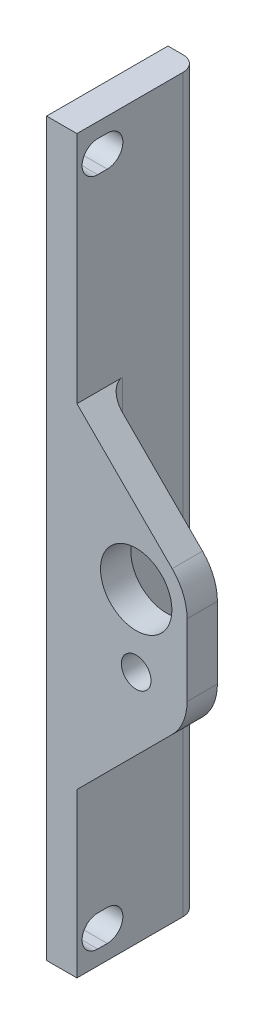
ISO-10303-21;
HEADER;
FILE_DESCRIPTION(('STEP AP214'),'2;1');
FILE_NAME('part.step','',(''),(''),'','','');
FILE_SCHEMA(('AUTOMOTIVE_DESIGN { 1 0 10303 214 1 1 1 1 }'));
ENDSEC;
DATA;
#1=APPLICATION_CONTEXT('core data for automotive mechanical design processes');
#2=APPLICATION_PROTOCOL_DEFINITION('international standard','automotive_design',2000,#1);
#3=PRODUCT_CONTEXT('',#1,'mechanical');
#4=PRODUCT('Part','Part','',(#3));
#5=PRODUCT_RELATED_PRODUCT_CATEGORY('part','',(#4));
#6=PRODUCT_DEFINITION_FORMATION('','',#4);
#7=PRODUCT_DEFINITION_CONTEXT('part definition',#1,'design');
#8=PRODUCT_DEFINITION('design','',#6,#7);
#9=PRODUCT_DEFINITION_SHAPE('','',#8);
#10=(LENGTH_UNIT() NAMED_UNIT(*) SI_UNIT(.MILLI.,.METRE.));
#11=(NAMED_UNIT(*) PLANE_ANGLE_UNIT() SI_UNIT($,.RADIAN.));
#12=(NAMED_UNIT(*) SI_UNIT($,.STERADIAN.) SOLID_ANGLE_UNIT());
#13=UNCERTAINTY_MEASURE_WITH_UNIT(LENGTH_MEASURE(1.E-05),#10,'distance_accuracy_value','');
#14=(GEOMETRIC_REPRESENTATION_CONTEXT(3) GLOBAL_UNCERTAINTY_ASSIGNED_CONTEXT((#13)) GLOBAL_UNIT_ASSIGNED_CONTEXT((#10,
#11,#12)) REPRESENTATION_CONTEXT('',''));
#15=CARTESIAN_POINT('',(0.,0.,0.));
#16=DIRECTION('',(0.,0.,1.));
#17=DIRECTION('',(1.,0.,0.));
#18=AXIS2_PLACEMENT_3D('',#15,#16,#17);
#19=CARTESIAN_POINT('',(6.35,0.,0.));
#20=DIRECTION('',(-1.,0.,0.));
#21=DIRECTION('',(0.,0.,1.));
#22=AXIS2_PLACEMENT_3D('',#19,#20,#21);
#23=PLANE('',#22);
#24=CARTESIAN_POINT('',(6.35,70.174739,0.));
#25=DIRECTION('',(1.,0.,0.));
#26=DIRECTION('',(0.,0.,-1.));
#27=AXIS2_PLACEMENT_3D('',#24,#25,#26);
#28=CIRCLE('',#27,3.2639);
#29=CARTESIAN_POINT('',(6.35,73.438639,0.));
#30=VERTEX_POINT('',#29);
#31=CARTESIAN_POINT('',(6.35,66.910839,0.));
#32=VERTEX_POINT('',#31);
#33=EDGE_CURVE('E244',#30,#32,#28,.T.);
#34=ORIENTED_EDGE('',*,*,#33,.F.);
#35=DIRECTION('',(0.,0.,1.));
#36=VECTOR('',#35,1.);
#37=CARTESIAN_POINT('',(6.35,73.438639,0.));
#38=LINE('',#37,#36);
#39=CARTESIAN_POINT('',(6.35,73.438639,-2.));
#40=VERTEX_POINT('',#39);
#41=EDGE_CURVE('E255',#40,#30,#38,.T.);
#42=ORIENTED_EDGE('',*,*,#41,.F.);
#43=CARTESIAN_POINT('',(6.35,70.174739,-2.));
#44=DIRECTION('',(1.,0.,0.));
#45=DIRECTION('',(0.,0.,-1.));
#46=AXIS2_PLACEMENT_3D('',#43,#44,#45);
#47=CIRCLE('',#46,3.2639);
#48=CARTESIAN_POINT('',(6.35,66.910839,-2.));
#49=VERTEX_POINT('',#48);
#50=EDGE_CURVE('E251',#49,#40,#47,.T.);
#51=ORIENTED_EDGE('',*,*,#50,.F.);
#52=DIRECTION('',(0.,0.,-1.));
#53=VECTOR('',#52,1.);
#54=CARTESIAN_POINT('',(6.35,66.910839,0.));
#55=LINE('',#54,#53);
#56=EDGE_CURVE('E247',#32,#49,#55,.T.);
#57=ORIENTED_EDGE('',*,*,#56,.F.);
#58=EDGE_LOOP('',(#34,#42,#51,#57));
#59=FACE_BOUND('',#58,.T.);
#60=CARTESIAN_POINT('',(6.35,-70.174739,-2.));
#61=DIRECTION('',(1.,0.,0.));
#62=DIRECTION('',(0.,0.,1.));
#63=AXIS2_PLACEMENT_3D('',#60,#61,#62);
#64=CIRCLE('',#63,3.2639);
#65=CARTESIAN_POINT('',(6.35,-73.438639,-2.));
#66=VERTEX_POINT('',#65);
#67=CARTESIAN_POINT('',(6.35,-66.910839,-2.));
#68=VERTEX_POINT('',#67);
#69=EDGE_CURVE('E287',#66,#68,#64,.T.);
#70=ORIENTED_EDGE('',*,*,#69,.F.);
#71=DIRECTION('',(0.,0.,-1.));
#72=VECTOR('',#71,1.);
#73=CARTESIAN_POINT('',(6.35,-73.438639,0.));
#74=LINE('',#73,#72);
#75=CARTESIAN_POINT('',(6.35,-73.438639,0.));
#76=VERTEX_POINT('',#75);
#77=EDGE_CURVE('E298',#76,#66,#74,.T.);
#78=ORIENTED_EDGE('',*,*,#77,.F.);
#79=CARTESIAN_POINT('',(6.35,-70.174739,0.));
#80=DIRECTION('',(1.,0.,0.));
#81=DIRECTION('',(0.,0.,1.));
#82=AXIS2_PLACEMENT_3D('',#79,#80,#81);
#83=CIRCLE('',#82,3.2639);
#84=CARTESIAN_POINT('',(6.35,-66.910839,0.));
#85=VERTEX_POINT('',#84);
#86=EDGE_CURVE('E294',#85,#76,#83,.T.);
#87=ORIENTED_EDGE('',*,*,#86,.F.);
#88=DIRECTION('',(0.,0.,1.));
#89=VECTOR('',#88,1.);
#90=CARTESIAN_POINT('',(6.35,-66.910839,0.));
#91=LINE('',#90,#89);
#92=EDGE_CURVE('E290',#68,#85,#91,.T.);
#93=ORIENTED_EDGE('',*,*,#92,.F.);
#94=EDGE_LOOP('',(#70,#78,#87,#93));
#95=FACE_BOUND('',#94,.T.);
#96=DIRECTION('',(0.,0.,-1.));
#97=VECTOR('',#96,1.);
#98=CARTESIAN_POINT('',(6.35,-76.524739,4.34721));
#99=LINE('',#98,#97);
#100=CARTESIAN_POINT('',(6.35,-76.524739,4.34721));
#101=VERTEX_POINT('',#100);
#102=CARTESIAN_POINT('',(6.35,-76.524739,-17.87779));
#103=VERTEX_POINT('',#102);
#104=EDGE_CURVE('E339',#101,#103,#99,.T.);
#105=ORIENTED_EDGE('',*,*,#104,.T.);
#106=DIRECTION('',(0.,1.,0.));
#107=VECTOR('',#106,1.);
#108=CARTESIAN_POINT('',(6.35,0.,-17.87779));
#109=LINE('',#108,#107);
#110=CARTESIAN_POINT('',(6.35,76.524739,-17.87779));
#111=VERTEX_POINT('',#110);
#112=EDGE_CURVE('E374',#103,#111,#109,.T.);
#113=ORIENTED_EDGE('',*,*,#112,.T.);
#114=DIRECTION('',(0.,0.,1.));
#115=VECTOR('',#114,1.);
#116=CARTESIAN_POINT('',(6.35,76.524739,-4.34721));
#117=LINE('',#116,#115);
#118=CARTESIAN_POINT('',(6.35,76.524739,4.34721));
#119=VERTEX_POINT('',#118);
#120=EDGE_CURVE('E330',#111,#119,#117,.T.);
#121=ORIENTED_EDGE('',*,*,#120,.T.);
#122=DIRECTION('',(0.,-1.,0.));
#123=VECTOR('',#122,1.);
#124=CARTESIAN_POINT('',(6.35,-76.524739,4.34721));
#125=LINE('',#124,#123);
#126=CARTESIAN_POINT('',(6.35,27.5676994392737,4.34721));
#127=VERTEX_POINT('',#126);
#128=EDGE_CURVE('E335',#119,#127,#125,.T.);
#129=ORIENTED_EDGE('',*,*,#128,.T.);
#130=DIRECTION('',(0.,0.,1.));
#131=VECTOR('',#130,1.);
#132=CARTESIAN_POINT('',(6.35,27.5676994392737,-2.00279));
#133=LINE('',#132,#131);
#134=CARTESIAN_POINT('',(6.35,27.5676994392737,-5.17779));
#135=VERTEX_POINT('',#134);
#136=EDGE_CURVE('E229',#135,#127,#133,.T.);
#137=ORIENTED_EDGE('',*,*,#136,.F.);
#138=DIRECTION('',(0.,-1.,0.));
#139=VECTOR('',#138,1.);
#140=CARTESIAN_POINT('',(6.35,0.,-5.17779));
#141=LINE('',#140,#139);
#142=CARTESIAN_POINT('',(6.35,-42.3561174392737,-5.17779));
#143=VERTEX_POINT('',#142);
#144=EDGE_CURVE('E370',#135,#143,#141,.T.);
#145=ORIENTED_EDGE('',*,*,#144,.T.);
#146=DIRECTION('',(0.,0.,1.));
#147=VECTOR('',#146,1.);
#148=CARTESIAN_POINT('',(6.35,-42.3561174392737,-2.00279));
#149=LINE('',#148,#147);
#150=CARTESIAN_POINT('',(6.35,-42.3561174392737,4.34721));
#151=VERTEX_POINT('',#150);
#152=EDGE_CURVE('E192',#143,#151,#149,.T.);
#153=ORIENTED_EDGE('',*,*,#152,.T.);
#154=EDGE_CURVE('E333',#151,#101,#125,.T.);
#155=ORIENTED_EDGE('',*,*,#154,.T.);
#156=EDGE_LOOP('',(#105,#113,#121,#129,#137,#145,#153,#155));
#157=FACE_BOUND('',#156,.T.);
#158=ADVANCED_FACE('F39',(#59,#95,#157),#23,.F.);
#159=CARTESIAN_POINT('',(0.,0.,0.));
#160=DIRECTION('',(-1.,0.,0.));
#161=DIRECTION('',(0.,0.,1.));
#162=AXIS2_PLACEMENT_3D('',#159,#160,#161);
#163=PLANE('',#162);
#164=DIRECTION('',(0.,0.,1.));
#165=VECTOR('',#164,1.);
#166=CARTESIAN_POINT('',(0.,76.524739,4.34721));
#167=LINE('',#166,#165);
#168=CARTESIAN_POINT('',(0.,76.524739,-21.05279));
#169=VERTEX_POINT('',#168);
#170=CARTESIAN_POINT('',(0.,76.524739,4.34721));
#171=VERTEX_POINT('',#170);
#172=EDGE_CURVE('E329',#169,#171,#167,.T.);
#173=ORIENTED_EDGE('',*,*,#172,.F.);
#174=DIRECTION('',(0.,1.,0.));
#175=VECTOR('',#174,1.);
#176=CARTESIAN_POINT('',(0.,76.524739,-21.05279));
#177=LINE('',#176,#175);
#178=CARTESIAN_POINT('',(0.,-76.524739,-21.05279));
#179=VERTEX_POINT('',#178);
#180=EDGE_CURVE('E334',#179,#169,#177,.T.);
#181=ORIENTED_EDGE('',*,*,#180,.F.);
#182=DIRECTION('',(0.,0.,-1.));
#183=VECTOR('',#182,1.);
#184=CARTESIAN_POINT('',(0.,-76.524739,-4.34721));
#185=LINE('',#184,#183);
#186=CARTESIAN_POINT('',(0.,-76.524739,4.34721));
#187=VERTEX_POINT('',#186);
#188=EDGE_CURVE('E350',#187,#179,#185,.T.);
#189=ORIENTED_EDGE('',*,*,#188,.F.);
#190=DIRECTION('',(0.,-1.,0.));
#191=VECTOR('',#190,1.);
#192=CARTESIAN_POINT('',(0.,-76.524739,4.34721));
#193=LINE('',#192,#191);
#194=EDGE_CURVE('E346',#171,#187,#193,.T.);
#195=ORIENTED_EDGE('',*,*,#194,.F.);
#196=EDGE_LOOP('',(#173,#181,#189,#195));
#197=FACE_BOUND('',#196,.T.);
#198=DIRECTION('',(0.,0.,-1.));
#199=VECTOR('',#198,1.);
#200=CARTESIAN_POINT('',(0.,-73.438639,0.));
#201=LINE('',#200,#199);
#202=CARTESIAN_POINT('',(0.,-73.438639,0.));
#203=VERTEX_POINT('',#202);
#204=CARTESIAN_POINT('',(0.,-73.438639,-2.));
#205=VERTEX_POINT('',#204);
#206=EDGE_CURVE('E291',#203,#205,#201,.T.);
#207=ORIENTED_EDGE('',*,*,#206,.T.);
#208=CARTESIAN_POINT('',(0.,-70.174739,-2.));
#209=DIRECTION('',(1.,0.,0.));
#210=DIRECTION('',(0.,0.,1.));
#211=AXIS2_PLACEMENT_3D('',#208,#209,#210);
#212=CIRCLE('',#211,3.2639);
#213=CARTESIAN_POINT('',(0.,-66.910839,-2.));
#214=VERTEX_POINT('',#213);
#215=EDGE_CURVE('E286',#205,#214,#212,.T.);
#216=ORIENTED_EDGE('',*,*,#215,.T.);
#217=DIRECTION('',(0.,0.,1.));
#218=VECTOR('',#217,1.);
#219=CARTESIAN_POINT('',(0.,-66.910839,0.));
#220=LINE('',#219,#218);
#221=CARTESIAN_POINT('',(0.,-66.910839,0.));
#222=VERTEX_POINT('',#221);
#223=EDGE_CURVE('E305',#214,#222,#220,.T.);
#224=ORIENTED_EDGE('',*,*,#223,.T.);
#225=CARTESIAN_POINT('',(0.,-70.174739,0.));
#226=DIRECTION('',(1.,0.,0.));
#227=DIRECTION('',(0.,0.,1.));
#228=AXIS2_PLACEMENT_3D('',#225,#226,#227);
#229=CIRCLE('',#228,3.2639);
#230=EDGE_CURVE('E309',#222,#203,#229,.T.);
#231=ORIENTED_EDGE('',*,*,#230,.T.);
#232=EDGE_LOOP('',(#207,#216,#224,#231));
#233=FACE_BOUND('',#232,.T.);
#234=DIRECTION('',(0.,0.,1.));
#235=VECTOR('',#234,1.);
#236=CARTESIAN_POINT('',(0.,73.438639,0.));
#237=LINE('',#236,#235);
#238=CARTESIAN_POINT('',(0.,73.438639,-2.));
#239=VERTEX_POINT('',#238);
#240=CARTESIAN_POINT('',(0.,73.438639,0.));
#241=VERTEX_POINT('',#240);
#242=EDGE_CURVE('E248',#239,#241,#237,.T.);
#243=ORIENTED_EDGE('',*,*,#242,.T.);
#244=CARTESIAN_POINT('',(0.,70.174739,0.));
#245=DIRECTION('',(1.,0.,0.));
#246=DIRECTION('',(0.,0.,-1.));
#247=AXIS2_PLACEMENT_3D('',#244,#245,#246);
#248=CIRCLE('',#247,3.2639);
#249=CARTESIAN_POINT('',(0.,66.910839,0.));
#250=VERTEX_POINT('',#249);
#251=EDGE_CURVE('E232',#241,#250,#248,.T.);
#252=ORIENTED_EDGE('',*,*,#251,.T.);
#253=DIRECTION('',(0.,0.,-1.));
#254=VECTOR('',#253,1.);
#255=CARTESIAN_POINT('',(0.,66.910839,0.));
#256=LINE('',#255,#254);
#257=CARTESIAN_POINT('',(0.,66.910839,-2.));
#258=VERTEX_POINT('',#257);
#259=EDGE_CURVE('E262',#250,#258,#256,.T.);
#260=ORIENTED_EDGE('',*,*,#259,.T.);
#261=CARTESIAN_POINT('',(0.,70.174739,-2.));
#262=DIRECTION('',(1.,0.,0.));
#263=DIRECTION('',(0.,0.,-1.));
#264=AXIS2_PLACEMENT_3D('',#261,#262,#263);
#265=CIRCLE('',#264,3.2639);
#266=EDGE_CURVE('E266',#258,#239,#265,.T.);
#267=ORIENTED_EDGE('',*,*,#266,.T.);
#268=EDGE_LOOP('',(#243,#252,#260,#267));
#269=FACE_BOUND('',#268,.T.);
#270=ADVANCED_FACE('F425',(#197,#233,#269),#163,.T.);
#271=CARTESIAN_POINT('',(6.35,76.524739,4.34721));
#272=DIRECTION('',(0.,-1.,0.));
#273=DIRECTION('',(0.,0.,-1.));
#274=AXIS2_PLACEMENT_3D('',#271,#272,#273);
#275=PLANE('',#274);
#276=ORIENTED_EDGE('',*,*,#120,.F.);
#277=CARTESIAN_POINT('',(3.175,76.524739,-17.87779));
#278=DIRECTION('',(0.,-1.,0.));
#279=DIRECTION('',(0.,0.,-1.));
#280=AXIS2_PLACEMENT_3D('',#277,#278,#279);
#281=CIRCLE('',#280,3.175);
#282=CARTESIAN_POINT('',(3.175,76.524739,-21.05279));
#283=VERTEX_POINT('',#282);
#284=EDGE_CURVE('E378',#111,#283,#281,.F.);
#285=ORIENTED_EDGE('',*,*,#284,.T.);
#286=DIRECTION('',(-1.,0.,0.));
#287=VECTOR('',#286,1.);
#288=CARTESIAN_POINT('',(6.35,76.524739,-21.05279));
#289=LINE('',#288,#287);
#290=EDGE_CURVE('E343',#283,#169,#289,.T.);
#291=ORIENTED_EDGE('',*,*,#290,.T.);
#292=ORIENTED_EDGE('',*,*,#172,.T.);
#293=DIRECTION('',(-1.,0.,0.));
#294=VECTOR('',#293,1.);
#295=CARTESIAN_POINT('',(6.35,76.524739,4.34721));
#296=LINE('',#295,#294);
#297=EDGE_CURVE('E366',#119,#171,#296,.T.);
#298=ORIENTED_EDGE('',*,*,#297,.F.);
#299=EDGE_LOOP('',(#276,#285,#291,#292,#298));
#300=FACE_BOUND('',#299,.T.);
#301=ADVANCED_FACE('F409',(#300),#275,.F.);
#302=CARTESIAN_POINT('',(6.35,-76.524739,4.34721));
#303=DIRECTION('',(0.,0.,-1.));
#304=DIRECTION('',(-1.,0.,0.));
#305=AXIS2_PLACEMENT_3D('',#302,#303,#304);
#306=PLANE('',#305);
#307=ORIENTED_EDGE('',*,*,#194,.T.);
#308=DIRECTION('',(-1.,0.,0.));
#309=VECTOR('',#308,1.);
#310=CARTESIAN_POINT('',(6.35,-76.524739,4.34721));
#311=LINE('',#310,#309);
#312=EDGE_CURVE('E362',#101,#187,#311,.T.);
#313=ORIENTED_EDGE('',*,*,#312,.F.);
#314=ORIENTED_EDGE('',*,*,#154,.F.);
#315=DIRECTION('',(0.707106781186543,0.707106781186552,0.));
#316=VECTOR('',#315,1.);
#317=CARTESIAN_POINT('',(26.2812212196368,-22.4248962196367,4.34721));
#318=LINE('',#317,#316);
#319=CARTESIAN_POINT('',(26.2812212196368,-22.4248962196367,4.34721));
#320=VERTEX_POINT('',#319);
#321=EDGE_CURVE('E212',#151,#320,#318,.T.);
#322=ORIENTED_EDGE('',*,*,#321,.T.);
#323=CARTESIAN_POINT('',(18.750534,-14.894209,4.34721));
#324=DIRECTION('',(0.,0.,1.));
#325=DIRECTION('',(-1.,0.,0.));
#326=AXIS2_PLACEMENT_3D('',#323,#324,#325);
#327=CIRCLE('',#326,10.65);
#328=CARTESIAN_POINT('',(29.400534,-14.894209,4.34721));
#329=VERTEX_POINT('',#328);
#330=EDGE_CURVE('E188',#320,#329,#327,.T.);
#331=ORIENTED_EDGE('',*,*,#330,.T.);
#332=DIRECTION('',(0.,1.,0.));
#333=VECTOR('',#332,1.);
#334=CARTESIAN_POINT('',(29.400534,0.105790999999995,4.34721));
#335=LINE('',#334,#333);
#336=CARTESIAN_POINT('',(29.400534,0.105790999999995,4.34721));
#337=VERTEX_POINT('',#336);
#338=EDGE_CURVE('E218',#329,#337,#335,.T.);
#339=ORIENTED_EDGE('',*,*,#338,.T.);
#340=CARTESIAN_POINT('',(18.750534,0.105790999999994,4.34721));
#341=DIRECTION('',(0.,0.,1.));
#342=DIRECTION('',(-1.,0.,0.));
#343=AXIS2_PLACEMENT_3D('',#340,#341,#342);
#344=CIRCLE('',#343,10.65);
#345=CARTESIAN_POINT('',(26.2812212196368,7.63647821963669,4.34721));
#346=VERTEX_POINT('',#345);
#347=EDGE_CURVE('E222',#337,#346,#344,.T.);
#348=ORIENTED_EDGE('',*,*,#347,.T.);
#349=DIRECTION('',(-0.707106781186544,0.707106781186551,0.));
#350=VECTOR('',#349,1.);
#351=CARTESIAN_POINT('',(6.35,27.5676994392737,4.34721));
#352=LINE('',#351,#350);
#353=EDGE_CURVE('E182',#346,#127,#352,.T.);
#354=ORIENTED_EDGE('',*,*,#353,.T.);
#355=ORIENTED_EDGE('',*,*,#128,.F.);
#356=ORIENTED_EDGE('',*,*,#297,.T.);
#357=EDGE_LOOP('',(#307,#313,#314,#322,#331,#339,#348,#354,#355,#356));
#358=FACE_BOUND('',#357,.T.);
#359=CARTESIAN_POINT('',(18.750534,-14.894209,4.34721));
#360=DIRECTION('',(0.,0.,1.));
#361=DIRECTION('',(1.,0.,0.));
#362=AXIS2_PLACEMENT_3D('',#359,#360,#361);
#363=CIRCLE('',#362,3.0999938);
#364=CARTESIAN_POINT('',(21.8505278,-14.894209,4.34721));
#365=VERTEX_POINT('',#364);
#366=EDGE_CURVE('E656',#365,#365,#363,.T.);
#367=ORIENTED_EDGE('',*,*,#366,.F.);
#368=EDGE_LOOP('',(#367));
#369=FACE_BOUND('',#368,.T.);
#370=CARTESIAN_POINT('',(18.750534,0.105790999999994,4.34721));
#371=DIRECTION('',(0.,0.,1.));
#372=DIRECTION('',(1.,0.,0.));
#373=AXIS2_PLACEMENT_3D('',#370,#371,#372);
#374=CIRCLE('',#373,7.475);
#375=CARTESIAN_POINT('',(26.225534,0.105790999999994,4.34721));
#376=VERTEX_POINT('',#375);
#377=EDGE_CURVE('E660',#376,#376,#374,.T.);
#378=ORIENTED_EDGE('',*,*,#377,.F.);
#379=EDGE_LOOP('',(#378));
#380=FACE_BOUND('',#379,.T.);
#381=ADVANCED_FACE('F396',(#358,#369,#380),#306,.F.);
#382=CARTESIAN_POINT('',(6.35,-76.524739,-4.34721));
#383=DIRECTION('',(0.,1.,0.));
#384=DIRECTION('',(0.,0.,1.));
#385=AXIS2_PLACEMENT_3D('',#382,#383,#384);
#386=PLANE('',#385);
#387=DIRECTION('',(-1.,0.,0.));
#388=VECTOR('',#387,1.);
#389=CARTESIAN_POINT('',(6.35,-76.524739,-21.05279));
#390=LINE('',#389,#388);
#391=CARTESIAN_POINT('',(3.175,-76.524739,-21.05279));
#392=VERTEX_POINT('',#391);
#393=EDGE_CURVE('E359',#392,#179,#390,.T.);
#394=ORIENTED_EDGE('',*,*,#393,.F.);
#395=CARTESIAN_POINT('',(3.175,-76.524739,-17.87779));
#396=DIRECTION('',(0.,1.,0.));
#397=DIRECTION('',(0.,0.,1.));
#398=AXIS2_PLACEMENT_3D('',#395,#396,#397);
#399=CIRCLE('',#398,3.175);
#400=EDGE_CURVE('E384',#392,#103,#399,.F.);
#401=ORIENTED_EDGE('',*,*,#400,.T.);
#402=ORIENTED_EDGE('',*,*,#104,.F.);
#403=ORIENTED_EDGE('',*,*,#312,.T.);
#404=ORIENTED_EDGE('',*,*,#188,.T.);
#405=EDGE_LOOP('',(#394,#401,#402,#403,#404));
#406=FACE_BOUND('',#405,.T.);
#407=ADVANCED_FACE('F401',(#406),#386,.F.);
#408=CARTESIAN_POINT('',(6.35,76.524739,-21.05279));
#409=DIRECTION('',(0.,0.,1.));
#410=DIRECTION('',(0.,-1.,0.));
#411=AXIS2_PLACEMENT_3D('',#408,#409,#410);
#412=PLANE('',#411);
#413=ORIENTED_EDGE('',*,*,#290,.F.);
#414=DIRECTION('',(0.,1.,0.));
#415=VECTOR('',#414,1.);
#416=CARTESIAN_POINT('',(3.175,76.524739,-21.05279));
#417=LINE('',#416,#415);
#418=EDGE_CURVE('E381',#283,#392,#417,.F.);
#419=ORIENTED_EDGE('',*,*,#418,.T.);
#420=ORIENTED_EDGE('',*,*,#393,.T.);
#421=ORIENTED_EDGE('',*,*,#180,.T.);
#422=EDGE_LOOP('',(#413,#419,#420,#421));
#423=FACE_BOUND('',#422,.T.);
#424=ADVANCED_FACE('F439',(#423),#412,.F.);
#425=CARTESIAN_POINT('',(6.35,-70.174739,-2.));
#426=DIRECTION('',(-1.,0.,0.));
#427=DIRECTION('',(0.,0.,1.));
#428=AXIS2_PLACEMENT_3D('',#425,#426,#427);
#429=CYLINDRICAL_SURFACE('',#428,3.2639);
#430=ORIENTED_EDGE('',*,*,#215,.F.);
#431=DIRECTION('',(-1.,0.,0.));
#432=VECTOR('',#431,1.);
#433=CARTESIAN_POINT('',(6.35,-73.438639,-2.));
#434=LINE('',#433,#432);
#435=EDGE_CURVE('E301',#66,#205,#434,.T.);
#436=ORIENTED_EDGE('',*,*,#435,.F.);
#437=ORIENTED_EDGE('',*,*,#69,.T.);
#438=DIRECTION('',(-1.,0.,0.));
#439=VECTOR('',#438,1.);
#440=CARTESIAN_POINT('',(6.35,-66.910839,-2.));
#441=LINE('',#440,#439);
#442=EDGE_CURVE('E325',#68,#214,#441,.T.);
#443=ORIENTED_EDGE('',*,*,#442,.T.);
#444=EDGE_LOOP('',(#430,#436,#437,#443));
#445=FACE_BOUND('',#444,.T.);
#446=ADVANCED_FACE('F436',(#445),#429,.F.);
#447=CARTESIAN_POINT('',(6.35,-66.910839,0.));
#448=DIRECTION('',(0.,-1.,0.));
#449=DIRECTION('',(0.,0.,-1.));
#450=AXIS2_PLACEMENT_3D('',#447,#448,#449);
#451=PLANE('',#450);
#452=ORIENTED_EDGE('',*,*,#223,.F.);
#453=ORIENTED_EDGE('',*,*,#442,.F.);
#454=ORIENTED_EDGE('',*,*,#92,.T.);
#455=DIRECTION('',(-1.,0.,0.));
#456=VECTOR('',#455,1.);
#457=CARTESIAN_POINT('',(6.35,-66.910839,0.));
#458=LINE('',#457,#456);
#459=EDGE_CURVE('E322',#85,#222,#458,.T.);
#460=ORIENTED_EDGE('',*,*,#459,.T.);
#461=EDGE_LOOP('',(#452,#453,#454,#460));
#462=FACE_BOUND('',#461,.T.);
#463=ADVANCED_FACE('F473',(#462),#451,.T.);
#464=CARTESIAN_POINT('',(6.35,-70.174739,0.));
#465=DIRECTION('',(-1.,0.,0.));
#466=DIRECTION('',(0.,0.,1.));
#467=AXIS2_PLACEMENT_3D('',#464,#465,#466);
#468=CYLINDRICAL_SURFACE('',#467,3.2639);
#469=ORIENTED_EDGE('',*,*,#230,.F.);
#470=ORIENTED_EDGE('',*,*,#459,.F.);
#471=ORIENTED_EDGE('',*,*,#86,.T.);
#472=DIRECTION('',(-1.,0.,0.));
#473=VECTOR('',#472,1.);
#474=CARTESIAN_POINT('',(6.35,-73.438639,0.));
#475=LINE('',#474,#473);
#476=EDGE_CURVE('E319',#76,#203,#475,.T.);
#477=ORIENTED_EDGE('',*,*,#476,.T.);
#478=EDGE_LOOP('',(#469,#470,#471,#477));
#479=FACE_BOUND('',#478,.T.);
#480=ADVANCED_FACE('F480',(#479),#468,.F.);
#481=CARTESIAN_POINT('',(6.35,-73.438639,0.));
#482=DIRECTION('',(0.,1.,0.));
#483=DIRECTION('',(0.,0.,1.));
#484=AXIS2_PLACEMENT_3D('',#481,#482,#483);
#485=PLANE('',#484);
#486=ORIENTED_EDGE('',*,*,#206,.F.);
#487=ORIENTED_EDGE('',*,*,#476,.F.);
#488=ORIENTED_EDGE('',*,*,#77,.T.);
#489=ORIENTED_EDGE('',*,*,#435,.T.);
#490=EDGE_LOOP('',(#486,#487,#488,#489));
#491=FACE_BOUND('',#490,.T.);
#492=ADVANCED_FACE('F487',(#491),#485,.T.);
#493=CARTESIAN_POINT('',(6.35,70.174739,0.));
#494=DIRECTION('',(-1.,0.,0.));
#495=DIRECTION('',(0.,0.,1.));
#496=AXIS2_PLACEMENT_3D('',#493,#494,#495);
#497=CYLINDRICAL_SURFACE('',#496,3.2639);
#498=ORIENTED_EDGE('',*,*,#251,.F.);
#499=DIRECTION('',(-1.,0.,0.));
#500=VECTOR('',#499,1.);
#501=CARTESIAN_POINT('',(6.35,73.438639,0.));
#502=LINE('',#501,#500);
#503=EDGE_CURVE('E258',#30,#241,#502,.T.);
#504=ORIENTED_EDGE('',*,*,#503,.F.);
#505=ORIENTED_EDGE('',*,*,#33,.T.);
#506=DIRECTION('',(-1.,0.,0.));
#507=VECTOR('',#506,1.);
#508=CARTESIAN_POINT('',(6.35,66.910839,0.));
#509=LINE('',#508,#507);
#510=EDGE_CURVE('E282',#32,#250,#509,.T.);
#511=ORIENTED_EDGE('',*,*,#510,.T.);
#512=EDGE_LOOP('',(#498,#504,#505,#511));
#513=FACE_BOUND('',#512,.T.);
#514=ADVANCED_FACE('F495',(#513),#497,.F.);
#515=CARTESIAN_POINT('',(6.35,66.910839,0.));
#516=DIRECTION('',(0.,1.,0.));
#517=DIRECTION('',(0.,0.,1.));
#518=AXIS2_PLACEMENT_3D('',#515,#516,#517);
#519=PLANE('',#518);
#520=ORIENTED_EDGE('',*,*,#259,.F.);
#521=ORIENTED_EDGE('',*,*,#510,.F.);
#522=ORIENTED_EDGE('',*,*,#56,.T.);
#523=DIRECTION('',(-1.,0.,0.));
#524=VECTOR('',#523,1.);
#525=CARTESIAN_POINT('',(6.35,66.910839,-2.));
#526=LINE('',#525,#524);
#527=EDGE_CURVE('E279',#49,#258,#526,.T.);
#528=ORIENTED_EDGE('',*,*,#527,.T.);
#529=EDGE_LOOP('',(#520,#521,#522,#528));
#530=FACE_BOUND('',#529,.T.);
#531=ADVANCED_FACE('F503',(#530),#519,.T.);
#532=CARTESIAN_POINT('',(6.35,70.174739,-2.));
#533=DIRECTION('',(-1.,0.,0.));
#534=DIRECTION('',(0.,0.,1.));
#535=AXIS2_PLACEMENT_3D('',#532,#533,#534);
#536=CYLINDRICAL_SURFACE('',#535,3.2639);
#537=ORIENTED_EDGE('',*,*,#266,.F.);
#538=ORIENTED_EDGE('',*,*,#527,.F.);
#539=ORIENTED_EDGE('',*,*,#50,.T.);
#540=DIRECTION('',(-1.,0.,0.));
#541=VECTOR('',#540,1.);
#542=CARTESIAN_POINT('',(6.35,73.438639,-2.));
#543=LINE('',#542,#541);
#544=EDGE_CURVE('E276',#40,#239,#543,.T.);
#545=ORIENTED_EDGE('',*,*,#544,.T.);
#546=EDGE_LOOP('',(#537,#538,#539,#545));
#547=FACE_BOUND('',#546,.T.);
#548=ADVANCED_FACE('F511',(#547),#536,.F.);
#549=CARTESIAN_POINT('',(6.35,73.438639,0.));
#550=DIRECTION('',(0.,-1.,0.));
#551=DIRECTION('',(0.,0.,-1.));
#552=AXIS2_PLACEMENT_3D('',#549,#550,#551);
#553=PLANE('',#552);
#554=ORIENTED_EDGE('',*,*,#242,.F.);
#555=ORIENTED_EDGE('',*,*,#544,.F.);
#556=ORIENTED_EDGE('',*,*,#41,.T.);
#557=ORIENTED_EDGE('',*,*,#503,.T.);
#558=EDGE_LOOP('',(#554,#555,#556,#557));
#559=FACE_BOUND('',#558,.T.);
#560=ADVANCED_FACE('F519',(#559),#553,.T.);
#561=CARTESIAN_POINT('',(6.35,27.5676994392737,-2.00279));
#562=DIRECTION('',(0.707106781186551,0.707106781186544,0.));
#563=DIRECTION('',(-0.707106781186544,0.707106781186551,0.));
#564=AXIS2_PLACEMENT_3D('',#561,#562,#563);
#565=PLANE('',#564);
#566=ORIENTED_EDGE('',*,*,#353,.F.);
#567=DIRECTION('',(0.,0.,1.));
#568=VECTOR('',#567,1.);
#569=CARTESIAN_POINT('',(26.2812212196368,7.63647821963669,-2.00279));
#570=LINE('',#569,#568);
#571=CARTESIAN_POINT('',(26.2812212196368,7.63647821963669,-2.00279));
#572=VERTEX_POINT('',#571);
#573=EDGE_CURVE('E233',#572,#346,#570,.T.);
#574=ORIENTED_EDGE('',*,*,#573,.F.);
#575=DIRECTION('',(-0.707106781186544,0.707106781186551,0.));
#576=VECTOR('',#575,1.);
#577=CARTESIAN_POINT('',(6.35,27.5676994392737,-2.00279));
#578=LINE('',#577,#576);
#579=CARTESIAN_POINT('',(9.525,24.3926994392736,-2.00279));
#580=VERTEX_POINT('',#579);
#581=EDGE_CURVE('E209',#572,#580,#578,.T.);
#582=ORIENTED_EDGE('',*,*,#581,.T.);
#583=CARTESIAN_POINT('',(9.525,24.3926994392736,-5.17779));
#584=DIRECTION('',(0.707106781186551,0.707106781186544,0.));
#585=DIRECTION('',(0.707106781186544,-0.707106781186551,0.));
#586=AXIS2_PLACEMENT_3D('',#583,#584,#585);
#587=ELLIPSE('',#586,4.4901280605346,3.175);
#588=EDGE_CURVE('E11',#580,#135,#587,.F.);
#589=ORIENTED_EDGE('',*,*,#588,.T.);
#590=ORIENTED_EDGE('',*,*,#136,.T.);
#591=EDGE_LOOP('',(#566,#574,#582,#589,#590));
#592=FACE_BOUND('',#591,.T.);
#593=ADVANCED_FACE('F417',(#592),#565,.T.);
#594=CARTESIAN_POINT('',(18.750534,0.105790999999994,-2.00279));
#595=DIRECTION('',(0.,0.,1.));
#596=DIRECTION('',(1.,0.,0.));
#597=AXIS2_PLACEMENT_3D('',#594,#595,#596);
#598=CYLINDRICAL_SURFACE('',#597,10.65);
#599=ORIENTED_EDGE('',*,*,#347,.F.);
#600=DIRECTION('',(0.,0.,1.));
#601=VECTOR('',#600,1.);
#602=CARTESIAN_POINT('',(29.400534,0.105790999999995,-2.00279));
#603=LINE('',#602,#601);
#604=CARTESIAN_POINT('',(29.400534,0.105790999999995,-2.00279));
#605=VERTEX_POINT('',#604);
#606=EDGE_CURVE('E236',#605,#337,#603,.T.);
#607=ORIENTED_EDGE('',*,*,#606,.F.);
#608=CARTESIAN_POINT('',(18.750534,0.105790999999994,-2.00279));
#609=DIRECTION('',(0.,0.,1.));
#610=DIRECTION('',(-1.,0.,0.));
#611=AXIS2_PLACEMENT_3D('',#608,#609,#610);
#612=CIRCLE('',#611,10.65);
#613=EDGE_CURVE('E202',#605,#572,#612,.T.);
#614=ORIENTED_EDGE('',*,*,#613,.T.);
#615=ORIENTED_EDGE('',*,*,#573,.T.);
#616=EDGE_LOOP('',(#599,#607,#614,#615));
#617=FACE_BOUND('',#616,.T.);
#618=ADVANCED_FACE('F532',(#617),#598,.T.);
#619=CARTESIAN_POINT('',(29.400534,0.105790999999995,-2.00279));
#620=DIRECTION('',(1.,0.,0.));
#621=DIRECTION('',(0.,0.,-1.));
#622=AXIS2_PLACEMENT_3D('',#619,#620,#621);
#623=PLANE('',#622);
#624=ORIENTED_EDGE('',*,*,#338,.F.);
#625=DIRECTION('',(0.,0.,1.));
#626=VECTOR('',#625,1.);
#627=CARTESIAN_POINT('',(29.400534,-14.894209,-2.00279));
#628=LINE('',#627,#626);
#629=CARTESIAN_POINT('',(29.400534,-14.894209,-2.00279));
#630=VERTEX_POINT('',#629);
#631=EDGE_CURVE('E191',#630,#329,#628,.T.);
#632=ORIENTED_EDGE('',*,*,#631,.F.);
#633=DIRECTION('',(0.,1.,0.));
#634=VECTOR('',#633,1.);
#635=CARTESIAN_POINT('',(29.400534,0.105790999999995,-2.00279));
#636=LINE('',#635,#634);
#637=EDGE_CURVE('E198',#630,#605,#636,.T.);
#638=ORIENTED_EDGE('',*,*,#637,.T.);
#639=ORIENTED_EDGE('',*,*,#606,.T.);
#640=EDGE_LOOP('',(#624,#632,#638,#639));
#641=FACE_BOUND('',#640,.T.);
#642=ADVANCED_FACE('F539',(#641),#623,.T.);
#643=CARTESIAN_POINT('',(18.750534,-14.894209,-2.00279));
#644=DIRECTION('',(0.,0.,1.));
#645=DIRECTION('',(1.,0.,0.));
#646=AXIS2_PLACEMENT_3D('',#643,#644,#645);
#647=CYLINDRICAL_SURFACE('',#646,10.65);
#648=ORIENTED_EDGE('',*,*,#330,.F.);
#649=DIRECTION('',(0.,0.,1.));
#650=VECTOR('',#649,1.);
#651=CARTESIAN_POINT('',(26.2812212196368,-22.4248962196367,-2.00279));
#652=LINE('',#651,#650);
#653=CARTESIAN_POINT('',(26.2812212196368,-22.4248962196367,-2.00279));
#654=VERTEX_POINT('',#653);
#655=EDGE_CURVE('E177',#654,#320,#652,.T.);
#656=ORIENTED_EDGE('',*,*,#655,.F.);
#657=CARTESIAN_POINT('',(18.750534,-14.894209,-2.00279));
#658=DIRECTION('',(0.,0.,1.));
#659=DIRECTION('',(-1.,0.,0.));
#660=AXIS2_PLACEMENT_3D('',#657,#658,#659);
#661=CIRCLE('',#660,10.65);
#662=EDGE_CURVE('E181',#654,#630,#661,.T.);
#663=ORIENTED_EDGE('',*,*,#662,.T.);
#664=ORIENTED_EDGE('',*,*,#631,.T.);
#665=EDGE_LOOP('',(#648,#656,#663,#664));
#666=FACE_BOUND('',#665,.T.);
#667=ADVANCED_FACE('F186',(#666),#647,.T.);
#668=CARTESIAN_POINT('',(26.2812212196368,-22.4248962196367,-2.00279));
#669=DIRECTION('',(0.707106781186552,-0.707106781186543,0.));
#670=DIRECTION('',(0.707106781186543,0.707106781186552,0.));
#671=AXIS2_PLACEMENT_3D('',#668,#669,#670);
#672=PLANE('',#671);
#673=ORIENTED_EDGE('',*,*,#321,.F.);
#674=ORIENTED_EDGE('',*,*,#152,.F.);
#675=CARTESIAN_POINT('',(9.525,-39.1811174392737,-5.17779));
#676=DIRECTION('',(0.707106781186552,-0.707106781186543,0.));
#677=DIRECTION('',(-0.707106781186543,-0.707106781186552,0.));
#678=AXIS2_PLACEMENT_3D('',#675,#676,#677);
#679=ELLIPSE('',#678,4.4901280605346,3.175);
#680=CARTESIAN_POINT('',(9.525,-39.1811174392737,-2.00279));
#681=VERTEX_POINT('',#680);
#682=EDGE_CURVE('E48',#143,#681,#679,.F.);
#683=ORIENTED_EDGE('',*,*,#682,.T.);
#684=DIRECTION('',(0.707106781186543,0.707106781186552,0.));
#685=VECTOR('',#684,1.);
#686=CARTESIAN_POINT('',(26.2812212196368,-22.4248962196367,-2.00279));
#687=LINE('',#686,#685);
#688=EDGE_CURVE('E174',#681,#654,#687,.T.);
#689=ORIENTED_EDGE('',*,*,#688,.T.);
#690=ORIENTED_EDGE('',*,*,#655,.T.);
#691=EDGE_LOOP('',(#673,#674,#683,#689,#690));
#692=FACE_BOUND('',#691,.T.);
#693=ADVANCED_FACE('F176',(#692),#672,.T.);
#694=CARTESIAN_POINT('',(18.750534,0.105790999999994,-2.00279));
#695=DIRECTION('',(0.,0.,-1.));
#696=DIRECTION('',(-1.,0.,0.));
#697=AXIS2_PLACEMENT_3D('',#694,#695,#696);
#698=PLANE('',#697);
#699=CARTESIAN_POINT('',(18.750534,-14.894209,-2.00279));
#700=DIRECTION('',(0.,0.,1.));
#701=DIRECTION('',(1.,0.,0.));
#702=AXIS2_PLACEMENT_3D('',#699,#700,#701);
#703=CIRCLE('',#702,3.0999938);
#704=CARTESIAN_POINT('',(21.8505278,-14.894209,-2.00279));
#705=VERTEX_POINT('',#704);
#706=EDGE_CURVE('E653',#705,#705,#703,.T.);
#707=ORIENTED_EDGE('',*,*,#706,.T.);
#708=EDGE_LOOP('',(#707));
#709=FACE_BOUND('',#708,.T.);
#710=CARTESIAN_POINT('',(18.750534,0.105790999999994,-2.00279));
#711=DIRECTION('',(0.,0.,1.));
#712=DIRECTION('',(1.,0.,0.));
#713=AXIS2_PLACEMENT_3D('',#710,#711,#712);
#714=CIRCLE('',#713,7.475);
#715=CARTESIAN_POINT('',(26.225534,0.105790999999994,-2.00279));
#716=VERTEX_POINT('',#715);
#717=EDGE_CURVE('E215',#716,#716,#714,.T.);
#718=ORIENTED_EDGE('',*,*,#717,.T.);
#719=EDGE_LOOP('',(#718));
#720=FACE_BOUND('',#719,.T.);
#721=ORIENTED_EDGE('',*,*,#688,.F.);
#722=DIRECTION('',(0.,-1.,0.));
#723=VECTOR('',#722,1.);
#724=CARTESIAN_POINT('',(9.525,0.105790999999994,-2.00279));
#725=LINE('',#724,#723);
#726=EDGE_CURVE('E61',#681,#580,#725,.F.);
#727=ORIENTED_EDGE('',*,*,#726,.T.);
#728=ORIENTED_EDGE('',*,*,#581,.F.);
#729=ORIENTED_EDGE('',*,*,#613,.F.);
#730=ORIENTED_EDGE('',*,*,#637,.F.);
#731=ORIENTED_EDGE('',*,*,#662,.F.);
#732=EDGE_LOOP('',(#721,#727,#728,#729,#730,#731));
#733=FACE_BOUND('',#732,.T.);
#734=ADVANCED_FACE('F195',(#709,#720,#733),#698,.T.);
#735=CARTESIAN_POINT('',(18.750534,0.105790999999994,-2.00279));
#736=DIRECTION('',(0.,0.,1.));
#737=DIRECTION('',(1.,0.,0.));
#738=AXIS2_PLACEMENT_3D('',#735,#736,#737);
#739=CYLINDRICAL_SURFACE('',#738,7.475);
#740=ORIENTED_EDGE('',*,*,#717,.F.);
#741=EDGE_LOOP('',(#740));
#742=FACE_BOUND('',#741,.T.);
#743=ORIENTED_EDGE('',*,*,#377,.T.);
#744=EDGE_LOOP('',(#743));
#745=FACE_BOUND('',#744,.T.);
#746=ADVANCED_FACE('F566',(#742,#745),#739,.F.);
#747=CARTESIAN_POINT('',(18.750534,-14.894209,-2.00279));
#748=DIRECTION('',(0.,0.,1.));
#749=DIRECTION('',(1.,0.,0.));
#750=AXIS2_PLACEMENT_3D('',#747,#748,#749);
#751=CYLINDRICAL_SURFACE('',#750,3.0999938);
#752=ORIENTED_EDGE('',*,*,#706,.F.);
#753=EDGE_LOOP('',(#752));
#754=FACE_BOUND('',#753,.T.);
#755=ORIENTED_EDGE('',*,*,#366,.T.);
#756=EDGE_LOOP('',(#755));
#757=FACE_BOUND('',#756,.T.);
#758=ADVANCED_FACE('F423',(#754,#757),#751,.F.);
#759=CARTESIAN_POINT('',(3.175,0.,-17.87779));
#760=DIRECTION('',(0.,1.,0.));
#761=DIRECTION('',(0.,0.,1.));
#762=AXIS2_PLACEMENT_3D('',#759,#760,#761);
#763=CYLINDRICAL_SURFACE('',#762,3.175);
#764=ORIENTED_EDGE('',*,*,#400,.F.);
#765=ORIENTED_EDGE('',*,*,#418,.F.);
#766=ORIENTED_EDGE('',*,*,#284,.F.);
#767=ORIENTED_EDGE('',*,*,#112,.F.);
#768=EDGE_LOOP('',(#764,#765,#766,#767));
#769=FACE_BOUND('',#768,.T.);
#770=ADVANCED_FACE('F405',(#769),#763,.T.);
#771=CARTESIAN_POINT('',(9.525,0.,-5.17779));
#772=DIRECTION('',(0.,-1.,0.));
#773=DIRECTION('',(0.,0.,-1.));
#774=AXIS2_PLACEMENT_3D('',#771,#772,#773);
#775=CYLINDRICAL_SURFACE('',#774,3.175);
#776=ORIENTED_EDGE('',*,*,#588,.F.);
#777=ORIENTED_EDGE('',*,*,#726,.F.);
#778=ORIENTED_EDGE('',*,*,#682,.F.);
#779=ORIENTED_EDGE('',*,*,#144,.F.);
#780=EDGE_LOOP('',(#776,#777,#778,#779));
#781=FACE_BOUND('',#780,.T.);
#782=ADVANCED_FACE('F41',(#781),#775,.F.);
#783=CLOSED_SHELL('',(#158,#270,#301,#381,#407,#424,#446,#463,#480,#492,#514,#531,#548,#560,
#593,#618,#642,#667,#693,#734,#746,#758,#770,#782));
#784=MANIFOLD_SOLID_BREP('B2',#783);
#785=ADVANCED_BREP_SHAPE_REPRESENTATION('',(#18,#784),#14);
#786=SHAPE_DEFINITION_REPRESENTATION(#9,#785);
ENDSEC;
END-ISO-10303-21;
